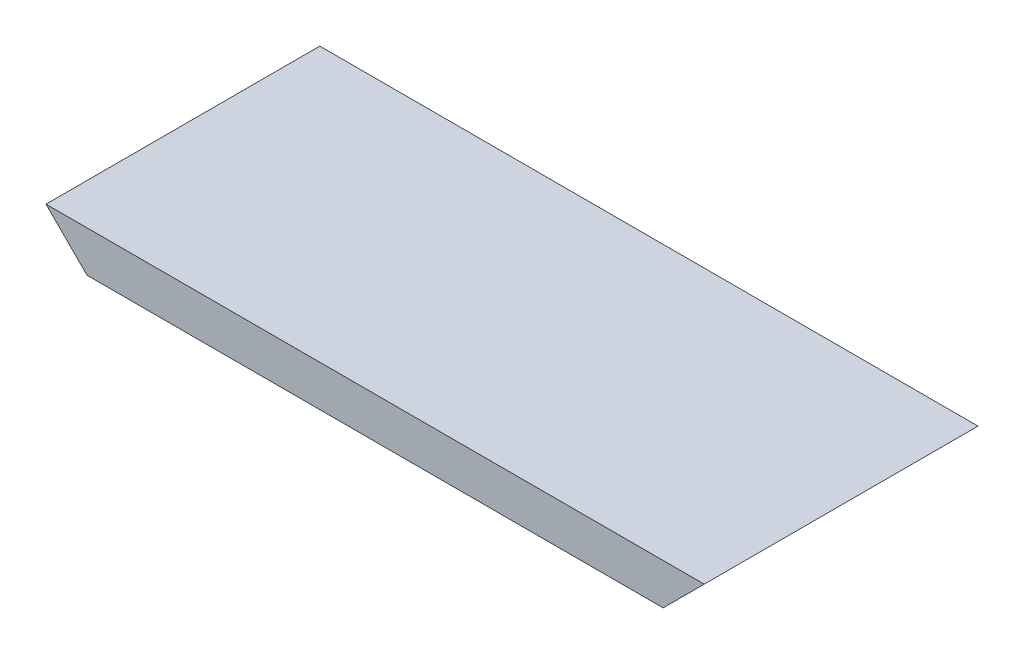
ISO-10303-21;
HEADER;
FILE_DESCRIPTION(('STEP AP214'),'2;1');
FILE_NAME('part.step','',(''),(''),'','','');
FILE_SCHEMA(('AUTOMOTIVE_DESIGN { 1 0 10303 214 1 1 1 1 }'));
ENDSEC;
DATA;
#1=APPLICATION_CONTEXT('core data for automotive mechanical design processes');
#2=APPLICATION_PROTOCOL_DEFINITION('international standard','automotive_design',2000,#1);
#3=PRODUCT_CONTEXT('',#1,'mechanical');
#4=PRODUCT('Part','Part','',(#3));
#5=PRODUCT_RELATED_PRODUCT_CATEGORY('part','',(#4));
#6=PRODUCT_DEFINITION_FORMATION('','',#4);
#7=PRODUCT_DEFINITION_CONTEXT('part definition',#1,'design');
#8=PRODUCT_DEFINITION('design','',#6,#7);
#9=PRODUCT_DEFINITION_SHAPE('','',#8);
#10=(LENGTH_UNIT() NAMED_UNIT(*) SI_UNIT(.MILLI.,.METRE.));
#11=(NAMED_UNIT(*) PLANE_ANGLE_UNIT() SI_UNIT($,.RADIAN.));
#12=(NAMED_UNIT(*) SI_UNIT($,.STERADIAN.) SOLID_ANGLE_UNIT());
#13=UNCERTAINTY_MEASURE_WITH_UNIT(LENGTH_MEASURE(1.E-05),#10,'distance_accuracy_value','');
#14=(GEOMETRIC_REPRESENTATION_CONTEXT(3) GLOBAL_UNCERTAINTY_ASSIGNED_CONTEXT((#13)) GLOBAL_UNIT_ASSIGNED_CONTEXT((#10,
#11,#12)) REPRESENTATION_CONTEXT('',''));
#15=CARTESIAN_POINT('',(0.,0.,0.));
#16=DIRECTION('',(0.,0.,1.));
#17=DIRECTION('',(1.,0.,0.));
#18=AXIS2_PLACEMENT_3D('',#15,#16,#17);
#19=CARTESIAN_POINT('',(-21.637867965644,2.85000000000001,-18.));
#20=DIRECTION('',(0.,1.,0.));
#21=DIRECTION('',(-1.,0.,0.));
#22=AXIS2_PLACEMENT_3D('',#19,#20,#21);
#23=PLANE('',#22);
#24=DIRECTION('',(-1.,0.,0.));
#25=VECTOR('',#24,1.);
#26=CARTESIAN_POINT('',(-21.637867965644,2.85000000000001,0.));
#27=LINE('',#26,#25);
#28=CARTESIAN_POINT('',(21.637867965644,2.85,0.));
#29=VERTEX_POINT('',#28);
#30=CARTESIAN_POINT('',(-21.637867965644,2.85000000000001,0.));
#31=VERTEX_POINT('',#30);
#32=EDGE_CURVE('E137',#29,#31,#27,.T.);
#33=ORIENTED_EDGE('',*,*,#32,.F.);
#34=DIRECTION('',(0.,0.,1.));
#35=VECTOR('',#34,1.);
#36=CARTESIAN_POINT('',(21.637867965644,2.85,-18.));
#37=LINE('',#36,#35);
#38=CARTESIAN_POINT('',(21.637867965644,2.85,-18.));
#39=VERTEX_POINT('',#38);
#40=EDGE_CURVE('E164',#39,#29,#37,.T.);
#41=ORIENTED_EDGE('',*,*,#40,.F.);
#42=DIRECTION('',(-1.,0.,0.));
#43=VECTOR('',#42,1.);
#44=CARTESIAN_POINT('',(-21.637867965644,2.85000000000001,-18.));
#45=LINE('',#44,#43);
#46=CARTESIAN_POINT('',(-21.637867965644,2.85000000000001,-18.));
#47=VERTEX_POINT('',#46);
#48=EDGE_CURVE('E140',#39,#47,#45,.T.);
#49=ORIENTED_EDGE('',*,*,#48,.T.);
#50=DIRECTION('',(0.,0.,1.));
#51=VECTOR('',#50,1.);
#52=CARTESIAN_POINT('',(-21.637867965644,2.85000000000001,-18.));
#53=LINE('',#52,#51);
#54=EDGE_CURVE('E153',#47,#31,#53,.T.);
#55=ORIENTED_EDGE('',*,*,#54,.T.);
#56=EDGE_LOOP('',(#33,#41,#49,#55));
#57=FACE_BOUND('',#56,.T.);
#58=ADVANCED_FACE('F33',(#57),#23,.T.);
#59=CARTESIAN_POINT('',(21.637867965644,2.85,-18.));
#60=DIRECTION('',(0.707106781186543,-0.707106781186551,0.));
#61=DIRECTION('',(0.707106781186551,0.707106781186544,0.));
#62=AXIS2_PLACEMENT_3D('',#59,#60,#61);
#63=PLANE('',#62);
#64=DIRECTION('',(0.707106781186551,0.707106781186544,0.));
#65=VECTOR('',#64,1.);
#66=CARTESIAN_POINT('',(21.637867965644,2.85,0.));
#67=LINE('',#66,#65);
#68=CARTESIAN_POINT('',(18.937867965644,0.15,0.));
#69=VERTEX_POINT('',#68);
#70=EDGE_CURVE('E144',#69,#29,#67,.T.);
#71=ORIENTED_EDGE('',*,*,#70,.F.);
#72=DIRECTION('',(0.,0.,1.));
#73=VECTOR('',#72,1.);
#74=CARTESIAN_POINT('',(18.937867965644,0.15,-18.));
#75=LINE('',#74,#73);
#76=CARTESIAN_POINT('',(18.937867965644,0.15,-18.));
#77=VERTEX_POINT('',#76);
#78=EDGE_CURVE('E166',#77,#69,#75,.T.);
#79=ORIENTED_EDGE('',*,*,#78,.F.);
#80=DIRECTION('',(0.707106781186551,0.707106781186544,0.));
#81=VECTOR('',#80,1.);
#82=CARTESIAN_POINT('',(21.637867965644,2.85,-18.));
#83=LINE('',#82,#81);
#84=EDGE_CURVE('E150',#77,#39,#83,.T.);
#85=ORIENTED_EDGE('',*,*,#84,.T.);
#86=ORIENTED_EDGE('',*,*,#40,.T.);
#87=EDGE_LOOP('',(#71,#79,#85,#86));
#88=FACE_BOUND('',#87,.T.);
#89=ADVANCED_FACE('F189',(#88),#63,.T.);
#90=CARTESIAN_POINT('',(18.937867965644,0.15,-18.));
#91=DIRECTION('',(0.,-1.,0.));
#92=DIRECTION('',(1.,0.,0.));
#93=AXIS2_PLACEMENT_3D('',#90,#91,#92);
#94=PLANE('',#93);
#95=DIRECTION('',(0.,0.,-1.));
#96=VECTOR('',#95,1.);
#97=CARTESIAN_POINT('',(-6.,0.149999999999997,-11.));
#98=LINE('',#97,#96);
#99=CARTESIAN_POINT('',(-6.,0.149999999999997,-3.));
#100=VERTEX_POINT('',#99);
#101=CARTESIAN_POINT('',(-6.,0.149999999999997,-11.));
#102=VERTEX_POINT('',#101);
#103=EDGE_CURVE('E128',#100,#102,#98,.T.);
#104=ORIENTED_EDGE('',*,*,#103,.F.);
#105=DIRECTION('',(-1.,0.,0.));
#106=VECTOR('',#105,1.);
#107=CARTESIAN_POINT('',(6.,0.149999999999998,-3.));
#108=LINE('',#107,#106);
#109=CARTESIAN_POINT('',(6.,0.149999999999998,-3.));
#110=VERTEX_POINT('',#109);
#111=EDGE_CURVE('E124',#110,#100,#108,.T.);
#112=ORIENTED_EDGE('',*,*,#111,.F.);
#113=DIRECTION('',(0.,0.,1.));
#114=VECTOR('',#113,1.);
#115=CARTESIAN_POINT('',(6.,0.149999999999998,-11.));
#116=LINE('',#115,#114);
#117=CARTESIAN_POINT('',(6.,0.149999999999998,-11.));
#118=VERTEX_POINT('',#117);
#119=EDGE_CURVE('E105',#118,#110,#116,.T.);
#120=ORIENTED_EDGE('',*,*,#119,.F.);
#121=DIRECTION('',(1.,0.,0.));
#122=VECTOR('',#121,1.);
#123=CARTESIAN_POINT('',(6.,0.149999999999998,-11.));
#124=LINE('',#123,#122);
#125=EDGE_CURVE('E121',#102,#118,#124,.T.);
#126=ORIENTED_EDGE('',*,*,#125,.F.);
#127=EDGE_LOOP('',(#104,#112,#120,#126));
#128=FACE_BOUND('',#127,.T.);
#129=DIRECTION('',(1.,0.,0.));
#130=VECTOR('',#129,1.);
#131=CARTESIAN_POINT('',(18.937867965644,0.15,0.));
#132=LINE('',#131,#130);
#133=CARTESIAN_POINT('',(-18.937867965644,0.149999999999995,0.));
#134=VERTEX_POINT('',#133);
#135=EDGE_CURVE('E159',#134,#69,#132,.T.);
#136=ORIENTED_EDGE('',*,*,#135,.F.);
#137=DIRECTION('',(0.,0.,1.));
#138=VECTOR('',#137,1.);
#139=CARTESIAN_POINT('',(-18.937867965644,0.149999999999995,-18.));
#140=LINE('',#139,#138);
#141=CARTESIAN_POINT('',(-18.937867965644,0.149999999999995,-18.));
#142=VERTEX_POINT('',#141);
#143=EDGE_CURVE('E168',#142,#134,#140,.T.);
#144=ORIENTED_EDGE('',*,*,#143,.F.);
#145=DIRECTION('',(1.,0.,0.));
#146=VECTOR('',#145,1.);
#147=CARTESIAN_POINT('',(18.937867965644,0.15,-18.));
#148=LINE('',#147,#146);
#149=EDGE_CURVE('E147',#142,#77,#148,.T.);
#150=ORIENTED_EDGE('',*,*,#149,.T.);
#151=ORIENTED_EDGE('',*,*,#78,.T.);
#152=EDGE_LOOP('',(#136,#144,#150,#151));
#153=FACE_BOUND('',#152,.T.);
#154=ADVANCED_FACE('F119',(#128,#153),#94,.T.);
#155=CARTESIAN_POINT('',(-18.937867965644,0.149999999999995,-18.));
#156=DIRECTION('',(-0.707106781186544,-0.707106781186551,0.));
#157=DIRECTION('',(0.707106781186551,-0.707106781186544,0.));
#158=AXIS2_PLACEMENT_3D('',#155,#156,#157);
#159=PLANE('',#158);
#160=DIRECTION('',(0.707106781186551,-0.707106781186544,0.));
#161=VECTOR('',#160,1.);
#162=CARTESIAN_POINT('',(-18.937867965644,0.149999999999995,0.));
#163=LINE('',#162,#161);
#164=EDGE_CURVE('E156',#31,#134,#163,.T.);
#165=ORIENTED_EDGE('',*,*,#164,.F.);
#166=ORIENTED_EDGE('',*,*,#54,.F.);
#167=DIRECTION('',(0.707106781186551,-0.707106781186544,0.));
#168=VECTOR('',#167,1.);
#169=CARTESIAN_POINT('',(-18.937867965644,0.149999999999995,-18.));
#170=LINE('',#169,#168);
#171=EDGE_CURVE('E143',#47,#142,#170,.T.);
#172=ORIENTED_EDGE('',*,*,#171,.T.);
#173=ORIENTED_EDGE('',*,*,#143,.T.);
#174=EDGE_LOOP('',(#165,#166,#172,#173));
#175=FACE_BOUND('',#174,.T.);
#176=ADVANCED_FACE('F199',(#175),#159,.T.);
#177=CARTESIAN_POINT('',(0.,0.,-18.));
#178=DIRECTION('',(0.,0.,-1.));
#179=DIRECTION('',(-1.,0.,0.));
#180=AXIS2_PLACEMENT_3D('',#177,#178,#179);
#181=PLANE('',#180);
#182=ORIENTED_EDGE('',*,*,#48,.F.);
#183=ORIENTED_EDGE('',*,*,#84,.F.);
#184=ORIENTED_EDGE('',*,*,#149,.F.);
#185=ORIENTED_EDGE('',*,*,#171,.F.);
#186=EDGE_LOOP('',(#182,#183,#184,#185));
#187=FACE_BOUND('',#186,.T.);
#188=ADVANCED_FACE('F202',(#187),#181,.T.);
#189=CARTESIAN_POINT('',(0.,0.,0.));
#190=DIRECTION('',(0.,0.,-1.));
#191=DIRECTION('',(-1.,0.,0.));
#192=AXIS2_PLACEMENT_3D('',#189,#190,#191);
#193=PLANE('',#192);
#194=ORIENTED_EDGE('',*,*,#32,.T.);
#195=ORIENTED_EDGE('',*,*,#164,.T.);
#196=ORIENTED_EDGE('',*,*,#135,.T.);
#197=ORIENTED_EDGE('',*,*,#70,.T.);
#198=EDGE_LOOP('',(#194,#195,#196,#197));
#199=FACE_BOUND('',#198,.T.);
#200=ADVANCED_FACE('F206',(#199),#193,.F.);
#201=CARTESIAN_POINT('',(-6.,2.15,-11.));
#202=DIRECTION('',(-1.,0.,0.));
#203=DIRECTION('',(0.,-1.,0.));
#204=AXIS2_PLACEMENT_3D('',#201,#202,#203);
#205=PLANE('',#204);
#206=DIRECTION('',(0.,0.,-1.));
#207=VECTOR('',#206,1.);
#208=CARTESIAN_POINT('',(-6.,2.15,-11.));
#209=LINE('',#208,#207);
#210=CARTESIAN_POINT('',(-6.,2.15,-3.5));
#211=VERTEX_POINT('',#210);
#212=CARTESIAN_POINT('',(-6.,2.15,-5.));
#213=VERTEX_POINT('',#212);
#214=EDGE_CURVE('E134',#211,#213,#209,.T.);
#215=ORIENTED_EDGE('',*,*,#214,.F.);
#216=CARTESIAN_POINT('',(-6.,1.65,-3.5));
#217=DIRECTION('',(-1.,0.,0.));
#218=DIRECTION('',(0.,-1.,0.));
#219=AXIS2_PLACEMENT_3D('',#216,#217,#218);
#220=CIRCLE('',#219,0.5);
#221=CARTESIAN_POINT('',(-6.,1.65,-3.));
#222=VERTEX_POINT('',#221);
#223=EDGE_CURVE('E55',#211,#222,#220,.F.);
#224=ORIENTED_EDGE('',*,*,#223,.T.);
#225=DIRECTION('',(0.,-1.,0.));
#226=VECTOR('',#225,1.);
#227=CARTESIAN_POINT('',(-6.,2.15,-3.));
#228=LINE('',#227,#226);
#229=EDGE_CURVE('E135',#222,#100,#228,.T.);
#230=ORIENTED_EDGE('',*,*,#229,.T.);
#231=ORIENTED_EDGE('',*,*,#103,.T.);
#232=CARTESIAN_POINT('',(-6.,-7.85,-5.));
#233=DIRECTION('',(-1.,0.,0.));
#234=DIRECTION('',(0.,-1.,0.));
#235=AXIS2_PLACEMENT_3D('',#232,#233,#234);
#236=CIRCLE('',#235,10.);
#237=EDGE_CURVE('E113',#102,#213,#236,.F.);
#238=ORIENTED_EDGE('',*,*,#237,.T.);
#239=EDGE_LOOP('',(#215,#224,#230,#231,#238));
#240=FACE_BOUND('',#239,.T.);
#241=ADVANCED_FACE('F181',(#240),#205,.F.);
#242=CARTESIAN_POINT('',(6.,2.15,-3.));
#243=DIRECTION('',(0.,0.,1.));
#244=DIRECTION('',(1.,0.,0.));
#245=AXIS2_PLACEMENT_3D('',#242,#243,#244);
#246=PLANE('',#245);
#247=ORIENTED_EDGE('',*,*,#229,.F.);
#248=DIRECTION('',(-1.,0.,0.));
#249=VECTOR('',#248,1.);
#250=CARTESIAN_POINT('',(6.,1.65,-3.));
#251=LINE('',#250,#249);
#252=CARTESIAN_POINT('',(6.,1.65,-3.));
#253=VERTEX_POINT('',#252);
#254=EDGE_CURVE('E41',#222,#253,#251,.F.);
#255=ORIENTED_EDGE('',*,*,#254,.T.);
#256=DIRECTION('',(0.,-1.,0.));
#257=VECTOR('',#256,1.);
#258=CARTESIAN_POINT('',(6.,2.15,-3.));
#259=LINE('',#258,#257);
#260=EDGE_CURVE('E138',#253,#110,#259,.T.);
#261=ORIENTED_EDGE('',*,*,#260,.T.);
#262=ORIENTED_EDGE('',*,*,#111,.T.);
#263=EDGE_LOOP('',(#247,#255,#261,#262));
#264=FACE_BOUND('',#263,.T.);
#265=ADVANCED_FACE('F183',(#264),#246,.F.);
#266=CARTESIAN_POINT('',(6.,2.15,-11.));
#267=DIRECTION('',(1.,0.,0.));
#268=DIRECTION('',(0.,1.,0.));
#269=AXIS2_PLACEMENT_3D('',#266,#267,#268);
#270=PLANE('',#269);
#271=ORIENTED_EDGE('',*,*,#260,.F.);
#272=CARTESIAN_POINT('',(6.,1.65,-3.5));
#273=DIRECTION('',(1.,0.,0.));
#274=DIRECTION('',(0.,1.,0.));
#275=AXIS2_PLACEMENT_3D('',#272,#273,#274);
#276=CIRCLE('',#275,0.5);
#277=CARTESIAN_POINT('',(6.,2.15,-3.5));
#278=VERTEX_POINT('',#277);
#279=EDGE_CURVE('E11',#253,#278,#276,.F.);
#280=ORIENTED_EDGE('',*,*,#279,.T.);
#281=DIRECTION('',(0.,0.,1.));
#282=VECTOR('',#281,1.);
#283=CARTESIAN_POINT('',(6.,2.15,-11.));
#284=LINE('',#283,#282);
#285=CARTESIAN_POINT('',(6.,2.15,-4.99999999999999));
#286=VERTEX_POINT('',#285);
#287=EDGE_CURVE('E108',#286,#278,#284,.T.);
#288=ORIENTED_EDGE('',*,*,#287,.F.);
#289=CARTESIAN_POINT('',(6.,-7.85,-4.99999999999999));
#290=DIRECTION('',(1.,0.,0.));
#291=DIRECTION('',(0.,1.,0.));
#292=AXIS2_PLACEMENT_3D('',#289,#290,#291);
#293=CIRCLE('',#292,10.);
#294=EDGE_CURVE('E102',#286,#118,#293,.F.);
#295=ORIENTED_EDGE('',*,*,#294,.T.);
#296=ORIENTED_EDGE('',*,*,#119,.T.);
#297=EDGE_LOOP('',(#271,#280,#288,#295,#296));
#298=FACE_BOUND('',#297,.T.);
#299=ADVANCED_FACE('F104',(#298),#270,.F.);
#300=CARTESIAN_POINT('',(0.,2.15,0.));
#301=DIRECTION('',(0.,-1.,0.));
#302=DIRECTION('',(1.,0.,0.));
#303=AXIS2_PLACEMENT_3D('',#300,#301,#302);
#304=PLANE('',#303);
#305=ORIENTED_EDGE('',*,*,#287,.T.);
#306=DIRECTION('',(-1.,0.,0.));
#307=VECTOR('',#306,1.);
#308=CARTESIAN_POINT('',(0.,2.15,-3.5));
#309=LINE('',#308,#307);
#310=EDGE_CURVE('E173',#278,#211,#309,.T.);
#311=ORIENTED_EDGE('',*,*,#310,.T.);
#312=ORIENTED_EDGE('',*,*,#214,.T.);
#313=DIRECTION('',(1.,0.,0.));
#314=VECTOR('',#313,1.);
#315=CARTESIAN_POINT('',(6.,2.15,-4.99999999999999));
#316=LINE('',#315,#314);
#317=EDGE_CURVE('E114',#213,#286,#316,.T.);
#318=ORIENTED_EDGE('',*,*,#317,.T.);
#319=EDGE_LOOP('',(#305,#311,#312,#318));
#320=FACE_BOUND('',#319,.T.);
#321=ADVANCED_FACE('F178',(#320),#304,.T.);
#322=CARTESIAN_POINT('',(6.,-7.85,-4.99999999999999));
#323=DIRECTION('',(-1.,0.,0.));
#324=DIRECTION('',(0.,0.,1.));
#325=AXIS2_PLACEMENT_3D('',#322,#323,#324);
#326=CYLINDRICAL_SURFACE('',#325,10.);
#327=ORIENTED_EDGE('',*,*,#237,.F.);
#328=ORIENTED_EDGE('',*,*,#125,.T.);
#329=ORIENTED_EDGE('',*,*,#294,.F.);
#330=ORIENTED_EDGE('',*,*,#317,.F.);
#331=EDGE_LOOP('',(#327,#328,#329,#330));
#332=FACE_BOUND('',#331,.T.);
#333=ADVANCED_FACE('F126',(#332),#326,.F.);
#334=CARTESIAN_POINT('',(0.,1.65,-3.5));
#335=DIRECTION('',(-1.,0.,0.));
#336=DIRECTION('',(0.,0.,1.));
#337=AXIS2_PLACEMENT_3D('',#334,#335,#336);
#338=CYLINDRICAL_SURFACE('',#337,0.5);
#339=ORIENTED_EDGE('',*,*,#279,.F.);
#340=ORIENTED_EDGE('',*,*,#254,.F.);
#341=ORIENTED_EDGE('',*,*,#223,.F.);
#342=ORIENTED_EDGE('',*,*,#310,.F.);
#343=EDGE_LOOP('',(#339,#340,#341,#342));
#344=FACE_BOUND('',#343,.T.);
#345=ADVANCED_FACE('F35',(#344),#338,.F.);
#346=CLOSED_SHELL('',(#58,#89,#154,#176,#188,#200,#241,#265,#299,#321,#333,#345));
#347=MANIFOLD_SOLID_BREP('B2',#346);
#348=ADVANCED_BREP_SHAPE_REPRESENTATION('',(#18,#347),#14);
#349=SHAPE_DEFINITION_REPRESENTATION(#9,#348);
ENDSEC;
END-ISO-10303-21;
